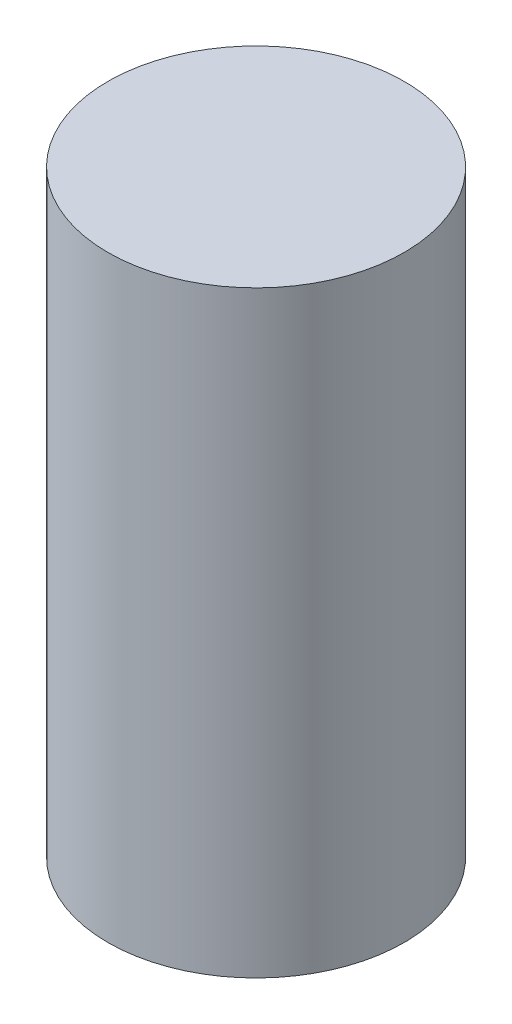
ISO-10303-21;
HEADER;
FILE_DESCRIPTION(('STEP AP214'),'2;1');
FILE_NAME('part.step','',(''),(''),'','','');
FILE_SCHEMA(('AUTOMOTIVE_DESIGN { 1 0 10303 214 1 1 1 1 }'));
ENDSEC;
DATA;
#1=APPLICATION_CONTEXT('core data for automotive mechanical design processes');
#2=APPLICATION_PROTOCOL_DEFINITION('international standard','automotive_design',2000,#1);
#3=PRODUCT_CONTEXT('',#1,'mechanical');
#4=PRODUCT('Part','Part','',(#3));
#5=PRODUCT_RELATED_PRODUCT_CATEGORY('part','',(#4));
#6=PRODUCT_DEFINITION_FORMATION('','',#4);
#7=PRODUCT_DEFINITION_CONTEXT('part definition',#1,'design');
#8=PRODUCT_DEFINITION('design','',#6,#7);
#9=PRODUCT_DEFINITION_SHAPE('','',#8);
#10=(LENGTH_UNIT() NAMED_UNIT(*) SI_UNIT(.MILLI.,.METRE.));
#11=(NAMED_UNIT(*) PLANE_ANGLE_UNIT() SI_UNIT($,.RADIAN.));
#12=(NAMED_UNIT(*) SI_UNIT($,.STERADIAN.) SOLID_ANGLE_UNIT());
#13=UNCERTAINTY_MEASURE_WITH_UNIT(LENGTH_MEASURE(1.E-05),#10,'distance_accuracy_value','');
#14=(GEOMETRIC_REPRESENTATION_CONTEXT(3) GLOBAL_UNCERTAINTY_ASSIGNED_CONTEXT((#13)) GLOBAL_UNIT_ASSIGNED_CONTEXT((#10,
#11,#12)) REPRESENTATION_CONTEXT('',''));
#15=CARTESIAN_POINT('',(0.,0.,0.));
#16=DIRECTION('',(0.,0.,1.));
#17=DIRECTION('',(1.,0.,0.));
#18=AXIS2_PLACEMENT_3D('',#15,#16,#17);
#19=CARTESIAN_POINT('',(0.,120.,0.));
#20=DIRECTION('',(0.,-1.,0.));
#21=DIRECTION('',(0.,0.,-1.));
#22=AXIS2_PLACEMENT_3D('',#19,#20,#21);
#23=CYLINDRICAL_SURFACE('',#22,29.75);
#24=CARTESIAN_POINT('',(0.,120.,0.));
#25=DIRECTION('',(0.,1.,0.));
#26=DIRECTION('',(0.,0.,1.));
#27=AXIS2_PLACEMENT_3D('',#24,#25,#26);
#28=CIRCLE('',#27,29.75);
#29=CARTESIAN_POINT('',(0.,120.,29.75));
#30=VERTEX_POINT('',#29);
#31=EDGE_CURVE('E10',#30,#30,#28,.T.);
#32=ORIENTED_EDGE('',*,*,#31,.F.);
#33=EDGE_LOOP('',(#32));
#34=FACE_BOUND('',#33,.T.);
#35=CARTESIAN_POINT('',(0.,0.,0.));
#36=DIRECTION('',(0.,1.,0.));
#37=DIRECTION('',(0.,0.,1.));
#38=AXIS2_PLACEMENT_3D('',#35,#36,#37);
#39=CIRCLE('',#38,29.75);
#40=CARTESIAN_POINT('',(0.,0.,29.75));
#41=VERTEX_POINT('',#40);
#42=EDGE_CURVE('E42',#41,#41,#39,.T.);
#43=ORIENTED_EDGE('',*,*,#42,.T.);
#44=EDGE_LOOP('',(#43));
#45=FACE_BOUND('',#44,.T.);
#46=ADVANCED_FACE('F39',(#34,#45),#23,.T.);
#47=CARTESIAN_POINT('',(0.,120.,0.));
#48=DIRECTION('',(0.,1.,0.));
#49=DIRECTION('',(0.,0.,1.));
#50=AXIS2_PLACEMENT_3D('',#47,#48,#49);
#51=PLANE('',#50);
#52=ORIENTED_EDGE('',*,*,#31,.T.);
#53=EDGE_LOOP('',(#52));
#54=FACE_BOUND('',#53,.T.);
#55=ADVANCED_FACE('F56',(#54),#51,.T.);
#56=CARTESIAN_POINT('',(0.,0.,0.));
#57=DIRECTION('',(0.,1.,0.));
#58=DIRECTION('',(0.,0.,1.));
#59=AXIS2_PLACEMENT_3D('',#56,#57,#58);
#60=PLANE('',#59);
#61=ORIENTED_EDGE('',*,*,#42,.F.);
#62=EDGE_LOOP('',(#61));
#63=FACE_BOUND('',#62,.T.);
#64=ADVANCED_FACE('F54',(#63),#60,.F.);
#65=CLOSED_SHELL('',(#46,#55,#64));
#66=MANIFOLD_SOLID_BREP('B2',#65);
#67=ADVANCED_BREP_SHAPE_REPRESENTATION('',(#18,#66),#14);
#68=SHAPE_DEFINITION_REPRESENTATION(#9,#67);
ENDSEC;
END-ISO-10303-21;
